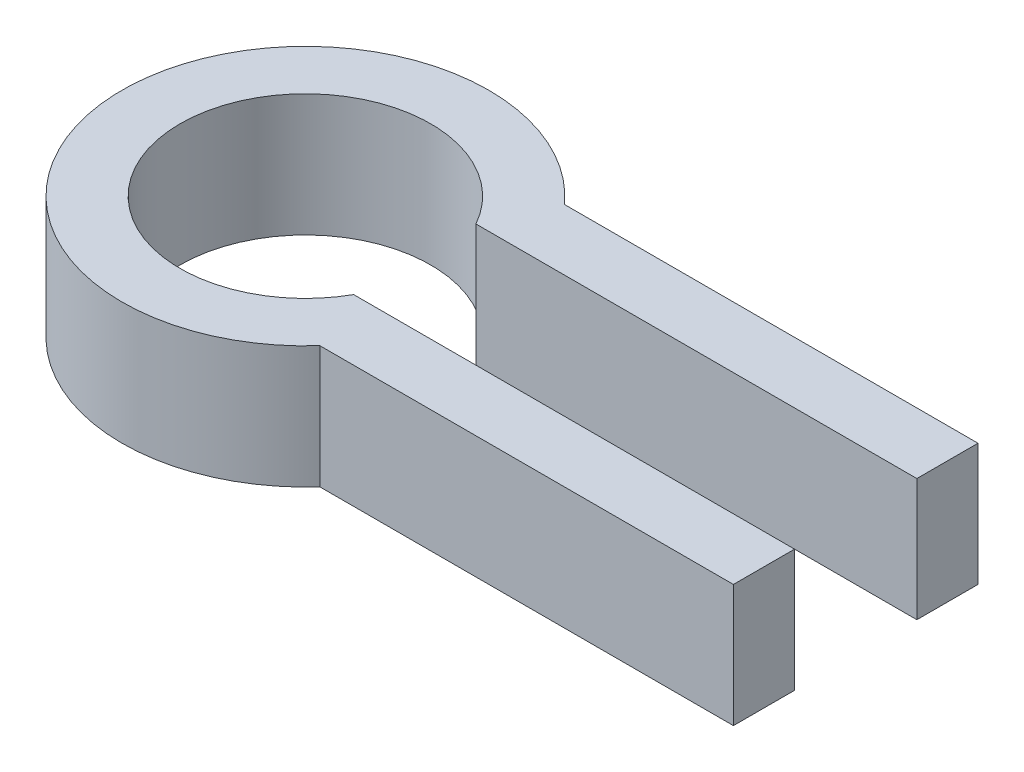
ISO-10303-21;
HEADER;
FILE_DESCRIPTION(('STEP AP214'),'2;1');
FILE_NAME('part.step','',(''),(''),'','','');
FILE_SCHEMA(('AUTOMOTIVE_DESIGN { 1 0 10303 214 1 1 1 1 }'));
ENDSEC;
DATA;
#1=APPLICATION_CONTEXT('core data for automotive mechanical design processes');
#2=APPLICATION_PROTOCOL_DEFINITION('international standard','automotive_design',2000,#1);
#3=PRODUCT_CONTEXT('',#1,'mechanical');
#4=PRODUCT('Part','Part','',(#3));
#5=PRODUCT_RELATED_PRODUCT_CATEGORY('part','',(#4));
#6=PRODUCT_DEFINITION_FORMATION('','',#4);
#7=PRODUCT_DEFINITION_CONTEXT('part definition',#1,'design');
#8=PRODUCT_DEFINITION('design','',#6,#7);
#9=PRODUCT_DEFINITION_SHAPE('','',#8);
#10=(LENGTH_UNIT() NAMED_UNIT(*) SI_UNIT(.MILLI.,.METRE.));
#11=(NAMED_UNIT(*) PLANE_ANGLE_UNIT() SI_UNIT($,.RADIAN.));
#12=(NAMED_UNIT(*) SI_UNIT($,.STERADIAN.) SOLID_ANGLE_UNIT());
#13=UNCERTAINTY_MEASURE_WITH_UNIT(LENGTH_MEASURE(1.E-05),#10,'distance_accuracy_value','');
#14=(GEOMETRIC_REPRESENTATION_CONTEXT(3) GLOBAL_UNCERTAINTY_ASSIGNED_CONTEXT((#13)) GLOBAL_UNIT_ASSIGNED_CONTEXT((#10,
#11,#12)) REPRESENTATION_CONTEXT('',''));
#15=CARTESIAN_POINT('',(0.,0.,0.));
#16=DIRECTION('',(0.,0.,1.));
#17=DIRECTION('',(1.,0.,0.));
#18=AXIS2_PLACEMENT_3D('',#15,#16,#17);
#19=CARTESIAN_POINT('',(0.,10.,-10.));
#20=DIRECTION('',(0.,0.,-1.));
#21=DIRECTION('',(-1.,0.,0.));
#22=AXIS2_PLACEMENT_3D('',#19,#20,#21);
#23=PLANE('',#22);
#24=DIRECTION('',(1.,0.,0.));
#25=VECTOR('',#24,1.);
#26=CARTESIAN_POINT('',(0.,10.,-10.));
#27=LINE('',#26,#25);
#28=CARTESIAN_POINT('',(11.1803398874989,10.,-10.));
#29=VERTEX_POINT('',#28);
#30=CARTESIAN_POINT('',(45.,10.,-10.));
#31=VERTEX_POINT('',#30);
#32=EDGE_CURVE('E110',#29,#31,#27,.T.);
#33=ORIENTED_EDGE('',*,*,#32,.T.);
#34=DIRECTION('',(0.,1.,0.));
#35=VECTOR('',#34,1.);
#36=CARTESIAN_POINT('',(45.,0.,-10.));
#37=LINE('',#36,#35);
#38=CARTESIAN_POINT('',(45.,0.,-10.));
#39=VERTEX_POINT('',#38);
#40=EDGE_CURVE('E98',#39,#31,#37,.T.);
#41=ORIENTED_EDGE('',*,*,#40,.F.);
#42=DIRECTION('',(1.,0.,0.));
#43=VECTOR('',#42,1.);
#44=CARTESIAN_POINT('',(0.,0.,-10.));
#45=LINE('',#44,#43);
#46=CARTESIAN_POINT('',(11.1803398874989,0.,-10.));
#47=VERTEX_POINT('',#46);
#48=EDGE_CURVE('E108',#47,#39,#45,.T.);
#49=ORIENTED_EDGE('',*,*,#48,.F.);
#50=DIRECTION('',(0.,-1.,0.));
#51=VECTOR('',#50,1.);
#52=CARTESIAN_POINT('',(11.1803398874989,10.,-10.));
#53=LINE('',#52,#51);
#54=EDGE_CURVE('E11',#29,#47,#53,.T.);
#55=ORIENTED_EDGE('',*,*,#54,.F.);
#56=EDGE_LOOP('',(#33,#41,#49,#55));
#57=FACE_BOUND('',#56,.T.);
#58=ADVANCED_FACE('F35',(#57),#23,.T.);
#59=CARTESIAN_POINT('',(0.,10.,10.));
#60=DIRECTION('',(0.,0.,-1.));
#61=DIRECTION('',(-1.,0.,0.));
#62=AXIS2_PLACEMENT_3D('',#59,#60,#61);
#63=PLANE('',#62);
#64=DIRECTION('',(0.,-1.,0.));
#65=VECTOR('',#64,1.);
#66=CARTESIAN_POINT('',(45.,10.,9.99999999999999));
#67=LINE('',#66,#65);
#68=CARTESIAN_POINT('',(45.,10.,9.99999999999999));
#69=VERTEX_POINT('',#68);
#70=CARTESIAN_POINT('',(45.,0.,9.99999999999999));
#71=VERTEX_POINT('',#70);
#72=EDGE_CURVE('E49',#69,#71,#67,.T.);
#73=ORIENTED_EDGE('',*,*,#72,.F.);
#74=DIRECTION('',(1.,0.,0.));
#75=VECTOR('',#74,1.);
#76=CARTESIAN_POINT('',(0.,10.,10.));
#77=LINE('',#76,#75);
#78=CARTESIAN_POINT('',(11.180339887499,10.,9.99999999999999));
#79=VERTEX_POINT('',#78);
#80=EDGE_CURVE('E144',#79,#69,#77,.T.);
#81=ORIENTED_EDGE('',*,*,#80,.F.);
#82=DIRECTION('',(0.,-1.,0.));
#83=VECTOR('',#82,1.);
#84=CARTESIAN_POINT('',(11.180339887499,10.,9.99999999999999));
#85=LINE('',#84,#83);
#86=CARTESIAN_POINT('',(11.180339887499,0.,9.99999999999999));
#87=VERTEX_POINT('',#86);
#88=EDGE_CURVE('E42',#79,#87,#85,.T.);
#89=ORIENTED_EDGE('',*,*,#88,.T.);
#90=DIRECTION('',(1.,0.,0.));
#91=VECTOR('',#90,1.);
#92=CARTESIAN_POINT('',(0.,0.,10.));
#93=LINE('',#92,#91);
#94=EDGE_CURVE('E118',#87,#71,#93,.T.);
#95=ORIENTED_EDGE('',*,*,#94,.T.);
#96=EDGE_LOOP('',(#73,#81,#89,#95));
#97=FACE_BOUND('',#96,.T.);
#98=ADVANCED_FACE('F142',(#97),#63,.F.);
#99=CARTESIAN_POINT('',(0.,10.,4.99999999999999));
#100=DIRECTION('',(0.,0.,-1.));
#101=DIRECTION('',(-1.,0.,0.));
#102=AXIS2_PLACEMENT_3D('',#99,#100,#101);
#103=PLANE('',#102);
#104=DIRECTION('',(1.,0.,0.));
#105=VECTOR('',#104,1.);
#106=CARTESIAN_POINT('',(0.,10.,4.99999999999999));
#107=LINE('',#106,#105);
#108=CARTESIAN_POINT('',(8.94776508408664,10.,5.));
#109=VERTEX_POINT('',#108);
#110=CARTESIAN_POINT('',(45.,10.,5.));
#111=VERTEX_POINT('',#110);
#112=EDGE_CURVE('E161',#109,#111,#107,.T.);
#113=ORIENTED_EDGE('',*,*,#112,.T.);
#114=DIRECTION('',(0.,1.,0.));
#115=VECTOR('',#114,1.);
#116=CARTESIAN_POINT('',(45.,0.,5.));
#117=LINE('',#116,#115);
#118=CARTESIAN_POINT('',(45.,0.,5.));
#119=VERTEX_POINT('',#118);
#120=EDGE_CURVE('E150',#119,#111,#117,.T.);
#121=ORIENTED_EDGE('',*,*,#120,.F.);
#122=DIRECTION('',(1.,0.,0.));
#123=VECTOR('',#122,1.);
#124=CARTESIAN_POINT('',(0.,0.,4.99999999999999));
#125=LINE('',#124,#123);
#126=CARTESIAN_POINT('',(8.94776508408664,0.,5.));
#127=VERTEX_POINT('',#126);
#128=EDGE_CURVE('E127',#127,#119,#125,.T.);
#129=ORIENTED_EDGE('',*,*,#128,.F.);
#130=DIRECTION('',(0.,-1.,0.));
#131=VECTOR('',#130,1.);
#132=CARTESIAN_POINT('',(8.94776508408664,10.,5.));
#133=LINE('',#132,#131);
#134=EDGE_CURVE('E137',#109,#127,#133,.T.);
#135=ORIENTED_EDGE('',*,*,#134,.F.);
#136=EDGE_LOOP('',(#113,#121,#129,#135));
#137=FACE_BOUND('',#136,.T.);
#138=ADVANCED_FACE('F178',(#137),#103,.T.);
#139=CARTESIAN_POINT('',(0.,10.,-5.));
#140=DIRECTION('',(0.,0.,-1.));
#141=DIRECTION('',(-1.,0.,0.));
#142=AXIS2_PLACEMENT_3D('',#139,#140,#141);
#143=PLANE('',#142);
#144=DIRECTION('',(0.,-1.,0.));
#145=VECTOR('',#144,1.);
#146=CARTESIAN_POINT('',(45.,10.,-5.));
#147=LINE('',#146,#145);
#148=CARTESIAN_POINT('',(45.,10.,-5.));
#149=VERTEX_POINT('',#148);
#150=CARTESIAN_POINT('',(45.,0.,-5.));
#151=VERTEX_POINT('',#150);
#152=EDGE_CURVE('E57',#149,#151,#147,.T.);
#153=ORIENTED_EDGE('',*,*,#152,.F.);
#154=DIRECTION('',(1.,0.,0.));
#155=VECTOR('',#154,1.);
#156=CARTESIAN_POINT('',(0.,10.,-5.));
#157=LINE('',#156,#155);
#158=CARTESIAN_POINT('',(8.94776508408664,10.,-5.));
#159=VERTEX_POINT('',#158);
#160=EDGE_CURVE('E122',#159,#149,#157,.T.);
#161=ORIENTED_EDGE('',*,*,#160,.F.);
#162=DIRECTION('',(0.,-1.,0.));
#163=VECTOR('',#162,1.);
#164=CARTESIAN_POINT('',(8.94776508408664,10.,-5.));
#165=LINE('',#164,#163);
#166=CARTESIAN_POINT('',(8.94776508408664,0.,-5.));
#167=VERTEX_POINT('',#166);
#168=EDGE_CURVE('E135',#159,#167,#165,.T.);
#169=ORIENTED_EDGE('',*,*,#168,.T.);
#170=DIRECTION('',(1.,0.,0.));
#171=VECTOR('',#170,1.);
#172=CARTESIAN_POINT('',(0.,0.,-5.));
#173=LINE('',#172,#171);
#174=EDGE_CURVE('E133',#167,#151,#173,.T.);
#175=ORIENTED_EDGE('',*,*,#174,.T.);
#176=EDGE_LOOP('',(#153,#161,#169,#175));
#177=FACE_BOUND('',#176,.T.);
#178=ADVANCED_FACE('F173',(#177),#143,.F.);
#179=CARTESIAN_POINT('',(0.,10.,0.));
#180=DIRECTION('',(0.,1.,0.));
#181=DIRECTION('',(0.,0.,1.));
#182=AXIS2_PLACEMENT_3D('',#179,#180,#181);
#183=PLANE('',#182);
#184=ORIENTED_EDGE('',*,*,#160,.T.);
#185=DIRECTION('',(0.,0.,1.));
#186=VECTOR('',#185,1.);
#187=CARTESIAN_POINT('',(45.,10.,-10.));
#188=LINE('',#187,#186);
#189=EDGE_CURVE('E111',#31,#149,#188,.T.);
#190=ORIENTED_EDGE('',*,*,#189,.F.);
#191=ORIENTED_EDGE('',*,*,#32,.F.);
#192=CARTESIAN_POINT('',(0.,10.,0.));
#193=DIRECTION('',(0.,1.,0.));
#194=DIRECTION('',(0.,0.,1.));
#195=AXIS2_PLACEMENT_3D('',#192,#193,#194);
#196=CIRCLE('',#195,15.);
#197=EDGE_CURVE('E158',#29,#79,#196,.T.);
#198=ORIENTED_EDGE('',*,*,#197,.T.);
#199=ORIENTED_EDGE('',*,*,#80,.T.);
#200=DIRECTION('',(0.,0.,1.));
#201=VECTOR('',#200,1.);
#202=CARTESIAN_POINT('',(45.,10.,5.));
#203=LINE('',#202,#201);
#204=EDGE_CURVE('E152',#111,#69,#203,.T.);
#205=ORIENTED_EDGE('',*,*,#204,.F.);
#206=ORIENTED_EDGE('',*,*,#112,.F.);
#207=CARTESIAN_POINT('',(0.,10.,0.));
#208=DIRECTION('',(0.,1.,0.));
#209=DIRECTION('',(0.,0.,1.));
#210=AXIS2_PLACEMENT_3D('',#207,#208,#209);
#211=CIRCLE('',#210,10.25);
#212=EDGE_CURVE('E163',#159,#109,#211,.T.);
#213=ORIENTED_EDGE('',*,*,#212,.F.);
#214=EDGE_LOOP('',(#184,#190,#191,#198,#199,#205,#206,#213));
#215=FACE_BOUND('',#214,.T.);
#216=ADVANCED_FACE('F170',(#215),#183,.T.);
#217=CARTESIAN_POINT('',(0.,0.,0.));
#218=DIRECTION('',(0.,1.,0.));
#219=DIRECTION('',(0.,0.,1.));
#220=AXIS2_PLACEMENT_3D('',#217,#218,#219);
#221=PLANE('',#220);
#222=DIRECTION('',(0.,0.,-1.));
#223=VECTOR('',#222,1.);
#224=CARTESIAN_POINT('',(45.,0.,-5.));
#225=LINE('',#224,#223);
#226=EDGE_CURVE('E95',#151,#39,#225,.T.);
#227=ORIENTED_EDGE('',*,*,#226,.F.);
#228=ORIENTED_EDGE('',*,*,#174,.F.);
#229=CARTESIAN_POINT('',(0.,0.,0.));
#230=DIRECTION('',(0.,1.,0.));
#231=DIRECTION('',(0.,0.,1.));
#232=AXIS2_PLACEMENT_3D('',#229,#230,#231);
#233=CIRCLE('',#232,10.25);
#234=EDGE_CURVE('E130',#167,#127,#233,.T.);
#235=ORIENTED_EDGE('',*,*,#234,.T.);
#236=ORIENTED_EDGE('',*,*,#128,.T.);
#237=DIRECTION('',(0.,0.,-1.));
#238=VECTOR('',#237,1.);
#239=CARTESIAN_POINT('',(45.,0.,9.99999999999999));
#240=LINE('',#239,#238);
#241=EDGE_CURVE('E147',#71,#119,#240,.T.);
#242=ORIENTED_EDGE('',*,*,#241,.F.);
#243=ORIENTED_EDGE('',*,*,#94,.F.);
#244=CARTESIAN_POINT('',(0.,0.,0.));
#245=DIRECTION('',(0.,1.,0.));
#246=DIRECTION('',(0.,0.,1.));
#247=AXIS2_PLACEMENT_3D('',#244,#245,#246);
#248=CIRCLE('',#247,15.);
#249=EDGE_CURVE('E116',#47,#87,#248,.T.);
#250=ORIENTED_EDGE('',*,*,#249,.F.);
#251=ORIENTED_EDGE('',*,*,#48,.T.);
#252=EDGE_LOOP('',(#227,#228,#235,#236,#242,#243,#250,#251));
#253=FACE_BOUND('',#252,.T.);
#254=ADVANCED_FACE('F114',(#253),#221,.F.);
#255=CARTESIAN_POINT('',(0.,10.,0.));
#256=DIRECTION('',(0.,-1.,0.));
#257=DIRECTION('',(0.,0.,-1.));
#258=AXIS2_PLACEMENT_3D('',#255,#256,#257);
#259=CYLINDRICAL_SURFACE('',#258,15.);
#260=ORIENTED_EDGE('',*,*,#249,.T.);
#261=ORIENTED_EDGE('',*,*,#88,.F.);
#262=ORIENTED_EDGE('',*,*,#197,.F.);
#263=ORIENTED_EDGE('',*,*,#54,.T.);
#264=EDGE_LOOP('',(#260,#261,#262,#263));
#265=FACE_BOUND('',#264,.T.);
#266=ADVANCED_FACE('F181',(#265),#259,.T.);
#267=CARTESIAN_POINT('',(0.,10.,0.));
#268=DIRECTION('',(0.,-1.,0.));
#269=DIRECTION('',(0.,0.,-1.));
#270=AXIS2_PLACEMENT_3D('',#267,#268,#269);
#271=CYLINDRICAL_SURFACE('',#270,10.25);
#272=ORIENTED_EDGE('',*,*,#234,.F.);
#273=ORIENTED_EDGE('',*,*,#168,.F.);
#274=ORIENTED_EDGE('',*,*,#212,.T.);
#275=ORIENTED_EDGE('',*,*,#134,.T.);
#276=EDGE_LOOP('',(#272,#273,#274,#275));
#277=FACE_BOUND('',#276,.T.);
#278=ADVANCED_FACE('F176',(#277),#271,.F.);
#279=CARTESIAN_POINT('',(45.,0.,0.));
#280=DIRECTION('',(1.,0.,0.));
#281=DIRECTION('',(0.,0.,-1.));
#282=AXIS2_PLACEMENT_3D('',#279,#280,#281);
#283=PLANE('',#282);
#284=ORIENTED_EDGE('',*,*,#72,.T.);
#285=ORIENTED_EDGE('',*,*,#241,.T.);
#286=ORIENTED_EDGE('',*,*,#120,.T.);
#287=ORIENTED_EDGE('',*,*,#204,.T.);
#288=EDGE_LOOP('',(#284,#285,#286,#287));
#289=FACE_BOUND('',#288,.T.);
#290=ADVANCED_FACE('F180',(#289),#283,.T.);
#291=CARTESIAN_POINT('',(45.,0.,0.));
#292=DIRECTION('',(1.,0.,0.));
#293=DIRECTION('',(0.,0.,-1.));
#294=AXIS2_PLACEMENT_3D('',#291,#292,#293);
#295=PLANE('',#294);
#296=ORIENTED_EDGE('',*,*,#152,.T.);
#297=ORIENTED_EDGE('',*,*,#226,.T.);
#298=ORIENTED_EDGE('',*,*,#40,.T.);
#299=ORIENTED_EDGE('',*,*,#189,.T.);
#300=EDGE_LOOP('',(#296,#297,#298,#299));
#301=FACE_BOUND('',#300,.T.);
#302=ADVANCED_FACE('F97',(#301),#295,.T.);
#303=CLOSED_SHELL('',(#58,#98,#138,#178,#216,#254,#266,#278,#290,#302));
#304=MANIFOLD_SOLID_BREP('B2',#303);
#305=ADVANCED_BREP_SHAPE_REPRESENTATION('',(#18,#304),#14);
#306=SHAPE_DEFINITION_REPRESENTATION(#9,#305);
ENDSEC;
END-ISO-10303-21;
